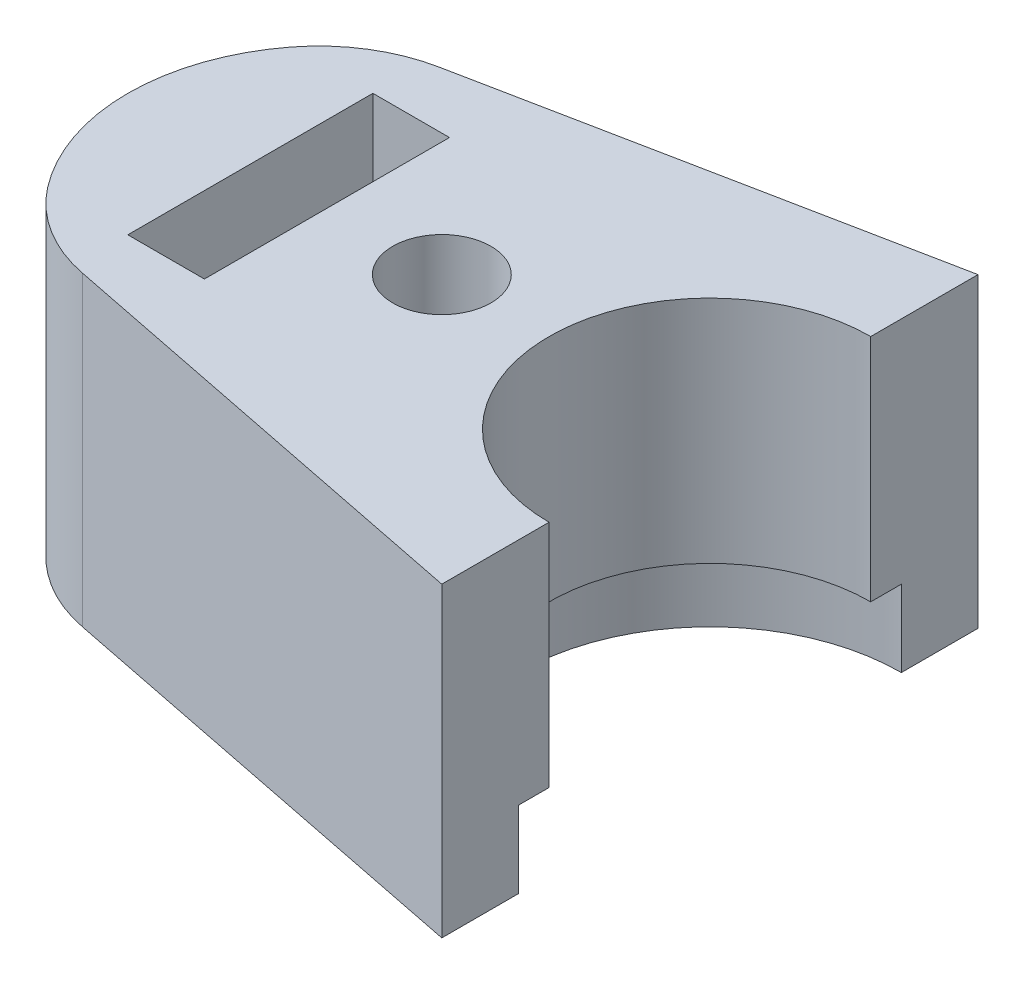
ISO-10303-21;
HEADER;
FILE_DESCRIPTION(('STEP AP214'),'2;1');
FILE_NAME('part.step','',(''),(''),'','','');
FILE_SCHEMA(('AUTOMOTIVE_DESIGN { 1 0 10303 214 1 1 1 1 }'));
ENDSEC;
DATA;
#1=APPLICATION_CONTEXT('core data for automotive mechanical design processes');
#2=APPLICATION_PROTOCOL_DEFINITION('international standard','automotive_design',2000,#1);
#3=PRODUCT_CONTEXT('',#1,'mechanical');
#4=PRODUCT('Part','Part','',(#3));
#5=PRODUCT_RELATED_PRODUCT_CATEGORY('part','',(#4));
#6=PRODUCT_DEFINITION_FORMATION('','',#4);
#7=PRODUCT_DEFINITION_CONTEXT('part definition',#1,'design');
#8=PRODUCT_DEFINITION('design','',#6,#7);
#9=PRODUCT_DEFINITION_SHAPE('','',#8);
#10=(LENGTH_UNIT() NAMED_UNIT(*) SI_UNIT(.MILLI.,.METRE.));
#11=(NAMED_UNIT(*) PLANE_ANGLE_UNIT() SI_UNIT($,.RADIAN.));
#12=(NAMED_UNIT(*) SI_UNIT($,.STERADIAN.) SOLID_ANGLE_UNIT());
#13=UNCERTAINTY_MEASURE_WITH_UNIT(LENGTH_MEASURE(1.E-05),#10,'distance_accuracy_value','');
#14=(GEOMETRIC_REPRESENTATION_CONTEXT(3) GLOBAL_UNCERTAINTY_ASSIGNED_CONTEXT((#13)) GLOBAL_UNIT_ASSIGNED_CONTEXT((#10,
#11,#12)) REPRESENTATION_CONTEXT('',''));
#15=CARTESIAN_POINT('',(0.,0.,0.));
#16=DIRECTION('',(0.,0.,1.));
#17=DIRECTION('',(1.,0.,0.));
#18=AXIS2_PLACEMENT_3D('',#15,#16,#17);
#19=CARTESIAN_POINT('',(0.,0.5,-0.8));
#20=DIRECTION('',(0.,0.,-1.));
#21=DIRECTION('',(-1.,0.,0.));
#22=AXIS2_PLACEMENT_3D('',#19,#20,#21);
#23=PLANE('',#22);
#24=DIRECTION('',(1.,0.,0.));
#25=VECTOR('',#24,1.);
#26=CARTESIAN_POINT('',(0.,0.,-0.8));
#27=LINE('',#26,#25);
#28=CARTESIAN_POINT('',(-4.25,0.,-0.8));
#29=VERTEX_POINT('',#28);
#30=CARTESIAN_POINT('',(-3.75,0.,-0.8));
#31=VERTEX_POINT('',#30);
#32=EDGE_CURVE('E122',#29,#31,#27,.T.);
#33=ORIENTED_EDGE('',*,*,#32,.T.);
#34=DIRECTION('',(0.,-1.,0.));
#35=VECTOR('',#34,1.);
#36=CARTESIAN_POINT('',(-3.75,0.5,-0.8));
#37=LINE('',#36,#35);
#38=CARTESIAN_POINT('',(-3.75,2.,-0.8));
#39=VERTEX_POINT('',#38);
#40=EDGE_CURVE('E11',#39,#31,#37,.T.);
#41=ORIENTED_EDGE('',*,*,#40,.F.);
#42=DIRECTION('',(1.,0.,0.));
#43=VECTOR('',#42,1.);
#44=CARTESIAN_POINT('',(0.,2.,-0.8));
#45=LINE('',#44,#43);
#46=CARTESIAN_POINT('',(-4.25,2.,-0.8));
#47=VERTEX_POINT('',#46);
#48=EDGE_CURVE('E197',#47,#39,#45,.T.);
#49=ORIENTED_EDGE('',*,*,#48,.F.);
#50=DIRECTION('',(0.,-1.,0.));
#51=VECTOR('',#50,1.);
#52=CARTESIAN_POINT('',(-4.25,0.5,-0.8));
#53=LINE('',#52,#51);
#54=EDGE_CURVE('E109',#47,#29,#53,.T.);
#55=ORIENTED_EDGE('',*,*,#54,.T.);
#56=EDGE_LOOP('',(#33,#41,#49,#55));
#57=FACE_BOUND('',#56,.T.);
#58=ADVANCED_FACE('F37',(#57),#23,.F.);
#59=CARTESIAN_POINT('',(-3.75,0.5,0.));
#60=DIRECTION('',(1.,0.,0.));
#61=DIRECTION('',(0.,0.,-1.));
#62=AXIS2_PLACEMENT_3D('',#59,#60,#61);
#63=PLANE('',#62);
#64=DIRECTION('',(0.,0.,1.));
#65=VECTOR('',#64,1.);
#66=CARTESIAN_POINT('',(-3.75,0.,0.));
#67=LINE('',#66,#65);
#68=CARTESIAN_POINT('',(-3.75,0.,0.8));
#69=VERTEX_POINT('',#68);
#70=EDGE_CURVE('E117',#31,#69,#67,.T.);
#71=ORIENTED_EDGE('',*,*,#70,.T.);
#72=DIRECTION('',(0.,-1.,0.));
#73=VECTOR('',#72,1.);
#74=CARTESIAN_POINT('',(-3.75,0.5,0.8));
#75=LINE('',#74,#73);
#76=CARTESIAN_POINT('',(-3.75,2.,0.8));
#77=VERTEX_POINT('',#76);
#78=EDGE_CURVE('E47',#77,#69,#75,.T.);
#79=ORIENTED_EDGE('',*,*,#78,.F.);
#80=DIRECTION('',(0.,0.,1.));
#81=VECTOR('',#80,1.);
#82=CARTESIAN_POINT('',(-3.75,2.,0.));
#83=LINE('',#82,#81);
#84=EDGE_CURVE('E192',#39,#77,#83,.T.);
#85=ORIENTED_EDGE('',*,*,#84,.F.);
#86=ORIENTED_EDGE('',*,*,#40,.T.);
#87=EDGE_LOOP('',(#71,#79,#85,#86));
#88=FACE_BOUND('',#87,.T.);
#89=ADVANCED_FACE('F186',(#88),#63,.F.);
#90=CARTESIAN_POINT('',(0.,0.5,0.8));
#91=DIRECTION('',(0.,0.,-1.));
#92=DIRECTION('',(-1.,0.,0.));
#93=AXIS2_PLACEMENT_3D('',#90,#91,#92);
#94=PLANE('',#93);
#95=DIRECTION('',(1.,0.,0.));
#96=VECTOR('',#95,1.);
#97=CARTESIAN_POINT('',(0.,0.,0.8));
#98=LINE('',#97,#96);
#99=CARTESIAN_POINT('',(-4.25,0.,0.8));
#100=VERTEX_POINT('',#99);
#101=EDGE_CURVE('E112',#100,#69,#98,.T.);
#102=ORIENTED_EDGE('',*,*,#101,.F.);
#103=DIRECTION('',(0.,-1.,0.));
#104=VECTOR('',#103,1.);
#105=CARTESIAN_POINT('',(-4.25,0.5,0.8));
#106=LINE('',#105,#104);
#107=CARTESIAN_POINT('',(-4.25,2.,0.8));
#108=VERTEX_POINT('',#107);
#109=EDGE_CURVE('E97',#108,#100,#106,.T.);
#110=ORIENTED_EDGE('',*,*,#109,.F.);
#111=DIRECTION('',(1.,0.,0.));
#112=VECTOR('',#111,1.);
#113=CARTESIAN_POINT('',(0.,2.,0.8));
#114=LINE('',#113,#112);
#115=EDGE_CURVE('E278',#108,#77,#114,.T.);
#116=ORIENTED_EDGE('',*,*,#115,.T.);
#117=ORIENTED_EDGE('',*,*,#78,.T.);
#118=EDGE_LOOP('',(#102,#110,#116,#117));
#119=FACE_BOUND('',#118,.T.);
#120=ADVANCED_FACE('F113',(#119),#94,.T.);
#121=CARTESIAN_POINT('',(-3.9873014814638,0.5,0.183542929297438));
#122=DIRECTION('',(0.,-1.,0.));
#123=DIRECTION('',(0.,0.,-1.));
#124=AXIS2_PLACEMENT_3D('',#121,#122,#123);
#125=CYLINDRICAL_SURFACE('',#124,1.);
#126=CARTESIAN_POINT('',(-3.9873014814638,0.,0.183542929297438));
#127=DIRECTION('',(0.,1.,0.));
#128=DIRECTION('',(0.,0.,1.));
#129=AXIS2_PLACEMENT_3D('',#126,#127,#128);
#130=CIRCLE('',#129,1.);
#131=CARTESIAN_POINT('',(-4.183235690524,0.,1.16415997265328));
#132=VERTEX_POINT('',#131);
#133=CARTESIAN_POINT('',(-4.77830641967648,0.,0.795352693622231));
#134=VERTEX_POINT('',#133);
#135=EDGE_CURVE('E160',#132,#134,#130,.F.);
#136=ORIENTED_EDGE('',*,*,#135,.F.);
#137=DIRECTION('',(0.,-1.,0.));
#138=VECTOR('',#137,1.);
#139=CARTESIAN_POINT('',(-4.183235690524,0.5,1.16415997265328));
#140=LINE('',#139,#138);
#141=CARTESIAN_POINT('',(-4.183235690524,2.,1.16415997265328));
#142=VERTEX_POINT('',#141);
#143=EDGE_CURVE('E130',#142,#132,#140,.T.);
#144=ORIENTED_EDGE('',*,*,#143,.F.);
#145=CARTESIAN_POINT('',(-3.9873014814638,2.,0.183542929297438));
#146=DIRECTION('',(0.,1.,0.));
#147=DIRECTION('',(0.,0.,1.));
#148=AXIS2_PLACEMENT_3D('',#145,#146,#147);
#149=CIRCLE('',#148,1.);
#150=CARTESIAN_POINT('',(-4.77830641967648,2.,0.795352693622231));
#151=VERTEX_POINT('',#150);
#152=EDGE_CURVE('E270',#142,#151,#149,.F.);
#153=ORIENTED_EDGE('',*,*,#152,.T.);
#154=DIRECTION('',(0.,-1.,0.));
#155=VECTOR('',#154,1.);
#156=CARTESIAN_POINT('',(-4.77830641967648,0.5,0.795352693622231));
#157=LINE('',#156,#155);
#158=EDGE_CURVE('E126',#151,#134,#157,.T.);
#159=ORIENTED_EDGE('',*,*,#158,.T.);
#160=EDGE_LOOP('',(#136,#144,#153,#159));
#161=FACE_BOUND('',#160,.T.);
#162=ADVANCED_FACE('F307',(#161),#125,.T.);
#163=CARTESIAN_POINT('',(-0.384272849561752,0.5,1.92321957143991));
#164=DIRECTION('',(-0.195934209060197,0.,0.980617043355843));
#165=DIRECTION('',(0.980617043355843,0.,0.195934209060197));
#166=AXIS2_PLACEMENT_3D('',#163,#164,#165);
#167=PLANE('',#166);
#168=DIRECTION('',(-0.980617043355843,0.,-0.195934209060197));
#169=VECTOR('',#168,1.);
#170=CARTESIAN_POINT('',(-0.384272849561752,0.,1.92321957143991));
#171=LINE('',#170,#169);
#172=CARTESIAN_POINT('',(-1.24999999999968,0.,1.7502411741825));
#173=VERTEX_POINT('',#172);
#174=EDGE_CURVE('E164',#173,#132,#171,.T.);
#175=ORIENTED_EDGE('',*,*,#174,.F.);
#176=DIRECTION('',(0.,-1.,0.));
#177=VECTOR('',#176,1.);
#178=CARTESIAN_POINT('',(-1.24999999999968,0.5,1.7502411741825));
#179=LINE('',#178,#177);
#180=CARTESIAN_POINT('',(-1.24999999999968,2.,1.7502411741825));
#181=VERTEX_POINT('',#180);
#182=EDGE_CURVE('E144',#181,#173,#179,.T.);
#183=ORIENTED_EDGE('',*,*,#182,.F.);
#184=DIRECTION('',(-0.980617043355843,0.,-0.195934209060197));
#185=VECTOR('',#184,1.);
#186=CARTESIAN_POINT('',(-0.384272849561752,2.,1.92321957143991));
#187=LINE('',#186,#185);
#188=EDGE_CURVE('E249',#181,#142,#187,.T.);
#189=ORIENTED_EDGE('',*,*,#188,.T.);
#190=ORIENTED_EDGE('',*,*,#143,.T.);
#191=EDGE_LOOP('',(#175,#183,#189,#190));
#192=FACE_BOUND('',#191,.T.);
#193=ADVANCED_FACE('F310',(#192),#167,.T.);
#194=CARTESIAN_POINT('',(-1.24999999999968,0.5,0.));
#195=DIRECTION('',(1.,0.,0.));
#196=DIRECTION('',(0.,0.,-1.));
#197=AXIS2_PLACEMENT_3D('',#194,#195,#196);
#198=PLANE('',#197);
#199=DIRECTION('',(0.,0.,1.));
#200=VECTOR('',#199,1.);
#201=CARTESIAN_POINT('',(-1.24999999999968,0.,0.));
#202=LINE('',#201,#200);
#203=CARTESIAN_POINT('',(-1.24999999999968,0.,1.24999999999969));
#204=VERTEX_POINT('',#203);
#205=EDGE_CURVE('E167',#204,#173,#202,.T.);
#206=ORIENTED_EDGE('',*,*,#205,.F.);
#207=DIRECTION('',(0.,-1.,0.));
#208=VECTOR('',#207,1.);
#209=CARTESIAN_POINT('',(-1.24999999999968,0.5,1.24999999999969));
#210=LINE('',#209,#208);
#211=CARTESIAN_POINT('',(-1.24999999999968,0.5,1.24999999999969));
#212=VERTEX_POINT('',#211);
#213=EDGE_CURVE('E146',#212,#204,#210,.T.);
#214=ORIENTED_EDGE('',*,*,#213,.F.);
#215=DIRECTION('',(0.,0.,-1.));
#216=VECTOR('',#215,1.);
#217=CARTESIAN_POINT('',(-1.24999999999968,0.5,0.));
#218=LINE('',#217,#216);
#219=CARTESIAN_POINT('',(-1.24999999999968,0.5,1.04999999999969));
#220=VERTEX_POINT('',#219);
#221=EDGE_CURVE('E55',#212,#220,#218,.T.);
#222=ORIENTED_EDGE('',*,*,#221,.T.);
#223=DIRECTION('',(0.,-1.,0.));
#224=VECTOR('',#223,1.);
#225=CARTESIAN_POINT('',(-1.24999999999968,2.,1.04999999999969));
#226=LINE('',#225,#224);
#227=CARTESIAN_POINT('',(-1.24999999999968,2.,1.04999999999969));
#228=VERTEX_POINT('',#227);
#229=EDGE_CURVE('E252',#228,#220,#226,.T.);
#230=ORIENTED_EDGE('',*,*,#229,.F.);
#231=DIRECTION('',(0.,0.,-1.));
#232=VECTOR('',#231,1.);
#233=CARTESIAN_POINT('',(-1.24999999999968,2.,0.));
#234=LINE('',#233,#232);
#235=EDGE_CURVE('E241',#181,#228,#234,.T.);
#236=ORIENTED_EDGE('',*,*,#235,.F.);
#237=ORIENTED_EDGE('',*,*,#182,.T.);
#238=EDGE_LOOP('',(#206,#214,#222,#230,#236,#237));
#239=FACE_BOUND('',#238,.T.);
#240=ADVANCED_FACE('F254',(#239),#198,.T.);
#241=CARTESIAN_POINT('',(-1.24999999999968,0.5,0.));
#242=DIRECTION('',(0.,-1.,0.));
#243=DIRECTION('',(0.,0.,-1.));
#244=AXIS2_PLACEMENT_3D('',#241,#242,#243);
#245=CYLINDRICAL_SURFACE('',#244,1.24999999999969);
#246=CARTESIAN_POINT('',(-1.24999999999968,0.,0.));
#247=DIRECTION('',(0.,1.,0.));
#248=DIRECTION('',(0.,0.,1.));
#249=AXIS2_PLACEMENT_3D('',#246,#247,#248);
#250=CIRCLE('',#249,1.24999999999969);
#251=CARTESIAN_POINT('',(-1.24999999999968,0.,-1.2499999999997));
#252=VERTEX_POINT('',#251);
#253=EDGE_CURVE('E170',#252,#204,#250,.T.);
#254=ORIENTED_EDGE('',*,*,#253,.F.);
#255=DIRECTION('',(0.,-1.,0.));
#256=VECTOR('',#255,1.);
#257=CARTESIAN_POINT('',(-1.24999999999968,0.5,-1.2499999999997));
#258=LINE('',#257,#256);
#259=CARTESIAN_POINT('',(-1.24999999999968,0.5,-1.2499999999997));
#260=VERTEX_POINT('',#259);
#261=EDGE_CURVE('E143',#260,#252,#258,.T.);
#262=ORIENTED_EDGE('',*,*,#261,.F.);
#263=CARTESIAN_POINT('',(-1.24999999999968,0.5,0.));
#264=DIRECTION('',(0.,1.,0.));
#265=DIRECTION('',(0.,0.,1.));
#266=AXIS2_PLACEMENT_3D('',#263,#264,#265);
#267=CIRCLE('',#266,1.24999999999969);
#268=EDGE_CURVE('E123',#260,#212,#267,.T.);
#269=ORIENTED_EDGE('',*,*,#268,.T.);
#270=ORIENTED_EDGE('',*,*,#213,.T.);
#271=EDGE_LOOP('',(#254,#262,#269,#270));
#272=FACE_BOUND('',#271,.T.);
#273=ADVANCED_FACE('F293',(#272),#245,.F.);
#274=CARTESIAN_POINT('',(-1.24999999999968,0.5,0.));
#275=DIRECTION('',(-1.,0.,0.));
#276=DIRECTION('',(0.,0.,1.));
#277=AXIS2_PLACEMENT_3D('',#274,#275,#276);
#278=PLANE('',#277);
#279=DIRECTION('',(0.,0.,-1.));
#280=VECTOR('',#279,1.);
#281=CARTESIAN_POINT('',(-1.24999999999968,0.,0.));
#282=LINE('',#281,#280);
#283=CARTESIAN_POINT('',(-1.24999999999968,0.,-1.7502411741825));
#284=VERTEX_POINT('',#283);
#285=EDGE_CURVE('E173',#252,#284,#282,.T.);
#286=ORIENTED_EDGE('',*,*,#285,.T.);
#287=DIRECTION('',(0.,-1.,0.));
#288=VECTOR('',#287,1.);
#289=CARTESIAN_POINT('',(-1.24999999999968,0.5,-1.7502411741825));
#290=LINE('',#289,#288);
#291=CARTESIAN_POINT('',(-1.24999999999968,2.,-1.7502411741825));
#292=VERTEX_POINT('',#291);
#293=EDGE_CURVE('E140',#292,#284,#290,.T.);
#294=ORIENTED_EDGE('',*,*,#293,.F.);
#295=DIRECTION('',(0.,0.,1.));
#296=VECTOR('',#295,1.);
#297=CARTESIAN_POINT('',(-1.24999999999968,2.,0.));
#298=LINE('',#297,#296);
#299=CARTESIAN_POINT('',(-1.24999999999968,2.,-1.0499999999997));
#300=VERTEX_POINT('',#299);
#301=EDGE_CURVE('E257',#292,#300,#298,.T.);
#302=ORIENTED_EDGE('',*,*,#301,.T.);
#303=DIRECTION('',(0.,-1.,0.));
#304=VECTOR('',#303,1.);
#305=CARTESIAN_POINT('',(-1.24999999999968,2.,-1.0499999999997));
#306=LINE('',#305,#304);
#307=CARTESIAN_POINT('',(-1.24999999999968,0.5,-1.0499999999997));
#308=VERTEX_POINT('',#307);
#309=EDGE_CURVE('E161',#300,#308,#306,.T.);
#310=ORIENTED_EDGE('',*,*,#309,.T.);
#311=DIRECTION('',(0.,0.,1.));
#312=VECTOR('',#311,1.);
#313=CARTESIAN_POINT('',(-1.24999999999968,0.5,0.));
#314=LINE('',#313,#312);
#315=EDGE_CURVE('E154',#260,#308,#314,.T.);
#316=ORIENTED_EDGE('',*,*,#315,.F.);
#317=ORIENTED_EDGE('',*,*,#261,.T.);
#318=EDGE_LOOP('',(#286,#294,#302,#310,#316,#317));
#319=FACE_BOUND('',#318,.T.);
#320=ADVANCED_FACE('F288',(#319),#278,.F.);
#321=CARTESIAN_POINT('',(-0.384272849561752,0.5,-1.92321957143991));
#322=DIRECTION('',(0.195934209060197,0.,0.980617043355843));
#323=DIRECTION('',(0.980617043355843,0.,-0.195934209060197));
#324=AXIS2_PLACEMENT_3D('',#321,#322,#323);
#325=PLANE('',#324);
#326=DIRECTION('',(-0.980617043355843,0.,0.195934209060197));
#327=VECTOR('',#326,1.);
#328=CARTESIAN_POINT('',(-0.384272849561752,0.,-1.92321957143991));
#329=LINE('',#328,#327);
#330=CARTESIAN_POINT('',(-4.183235690524,0.,-1.16415997265328));
#331=VERTEX_POINT('',#330);
#332=EDGE_CURVE('E176',#284,#331,#329,.T.);
#333=ORIENTED_EDGE('',*,*,#332,.T.);
#334=DIRECTION('',(0.,-1.,0.));
#335=VECTOR('',#334,1.);
#336=CARTESIAN_POINT('',(-4.183235690524,0.5,-1.16415997265328));
#337=LINE('',#336,#335);
#338=CARTESIAN_POINT('',(-4.183235690524,2.,-1.16415997265328));
#339=VERTEX_POINT('',#338);
#340=EDGE_CURVE('E137',#339,#331,#337,.T.);
#341=ORIENTED_EDGE('',*,*,#340,.F.);
#342=DIRECTION('',(-0.980617043355843,0.,0.195934209060197));
#343=VECTOR('',#342,1.);
#344=CARTESIAN_POINT('',(-0.384272849561752,2.,-1.92321957143991));
#345=LINE('',#344,#343);
#346=EDGE_CURVE('E259',#292,#339,#345,.T.);
#347=ORIENTED_EDGE('',*,*,#346,.F.);
#348=ORIENTED_EDGE('',*,*,#293,.T.);
#349=EDGE_LOOP('',(#333,#341,#347,#348));
#350=FACE_BOUND('',#349,.T.);
#351=ADVANCED_FACE('F298',(#350),#325,.F.);
#352=CARTESIAN_POINT('',(-3.9873014814638,0.5,-0.183542929297438));
#353=DIRECTION('',(0.,-1.,0.));
#354=DIRECTION('',(0.,0.,-1.));
#355=AXIS2_PLACEMENT_3D('',#352,#353,#354);
#356=CYLINDRICAL_SURFACE('',#355,1.);
#357=CARTESIAN_POINT('',(-3.9873014814638,0.,-0.183542929297438));
#358=DIRECTION('',(0.,1.,0.));
#359=DIRECTION('',(0.,0.,1.));
#360=AXIS2_PLACEMENT_3D('',#357,#358,#359);
#361=CIRCLE('',#360,1.);
#362=CARTESIAN_POINT('',(-4.77830641967648,0.,-0.795352693622231));
#363=VERTEX_POINT('',#362);
#364=EDGE_CURVE('E179',#331,#363,#361,.T.);
#365=ORIENTED_EDGE('',*,*,#364,.T.);
#366=DIRECTION('',(0.,-1.,0.));
#367=VECTOR('',#366,1.);
#368=CARTESIAN_POINT('',(-4.77830641967648,0.5,-0.795352693622231));
#369=LINE('',#368,#367);
#370=CARTESIAN_POINT('',(-4.77830641967648,2.,-0.795352693622231));
#371=VERTEX_POINT('',#370);
#372=EDGE_CURVE('E134',#371,#363,#369,.T.);
#373=ORIENTED_EDGE('',*,*,#372,.F.);
#374=CARTESIAN_POINT('',(-3.9873014814638,2.,-0.183542929297438));
#375=DIRECTION('',(0.,1.,0.));
#376=DIRECTION('',(0.,0.,1.));
#377=AXIS2_PLACEMENT_3D('',#374,#375,#376);
#378=CIRCLE('',#377,1.);
#379=EDGE_CURVE('E264',#339,#371,#378,.T.);
#380=ORIENTED_EDGE('',*,*,#379,.F.);
#381=ORIENTED_EDGE('',*,*,#340,.T.);
#382=EDGE_LOOP('',(#365,#373,#380,#381));
#383=FACE_BOUND('',#382,.T.);
#384=ADVANCED_FACE('F302',(#383),#356,.T.);
#385=CARTESIAN_POINT('',(-3.75,0.5,0.));
#386=DIRECTION('',(0.,-1.,0.));
#387=DIRECTION('',(0.,0.,-1.));
#388=AXIS2_PLACEMENT_3D('',#385,#386,#387);
#389=CYLINDRICAL_SURFACE('',#388,1.3);
#390=CARTESIAN_POINT('',(-3.75,0.,0.));
#391=DIRECTION('',(0.,1.,0.));
#392=DIRECTION('',(0.,0.,1.));
#393=AXIS2_PLACEMENT_3D('',#390,#391,#392);
#394=CIRCLE('',#393,1.3);
#395=EDGE_CURVE('E182',#363,#134,#394,.T.);
#396=ORIENTED_EDGE('',*,*,#395,.T.);
#397=ORIENTED_EDGE('',*,*,#158,.F.);
#398=CARTESIAN_POINT('',(-3.75,2.,0.));
#399=DIRECTION('',(0.,1.,0.));
#400=DIRECTION('',(0.,0.,1.));
#401=AXIS2_PLACEMENT_3D('',#398,#399,#400);
#402=CIRCLE('',#401,1.3);
#403=EDGE_CURVE('E267',#371,#151,#402,.T.);
#404=ORIENTED_EDGE('',*,*,#403,.F.);
#405=ORIENTED_EDGE('',*,*,#372,.T.);
#406=EDGE_LOOP('',(#396,#397,#404,#405));
#407=FACE_BOUND('',#406,.T.);
#408=ADVANCED_FACE('F304',(#407),#389,.T.);
#409=CARTESIAN_POINT('',(-3.,0.5,0.));
#410=DIRECTION('',(0.,-1.,0.));
#411=DIRECTION('',(0.,0.,-1.));
#412=AXIS2_PLACEMENT_3D('',#409,#410,#411);
#413=CYLINDRICAL_SURFACE('',#412,0.3207);
#414=CARTESIAN_POINT('',(-3.,0.,0.));
#415=DIRECTION('',(0.,1.,0.));
#416=DIRECTION('',(0.,0.,1.));
#417=AXIS2_PLACEMENT_3D('',#414,#415,#416);
#418=CIRCLE('',#417,0.3207);
#419=CARTESIAN_POINT('',(-3.,0.,0.3207));
#420=VERTEX_POINT('',#419);
#421=EDGE_CURVE('E157',#420,#420,#418,.T.);
#422=ORIENTED_EDGE('',*,*,#421,.F.);
#423=EDGE_LOOP('',(#422));
#424=FACE_BOUND('',#423,.T.);
#425=CARTESIAN_POINT('',(-3.,2.,0.));
#426=DIRECTION('',(0.,1.,0.));
#427=DIRECTION('',(0.,0.,1.));
#428=AXIS2_PLACEMENT_3D('',#425,#426,#427);
#429=CIRCLE('',#428,0.3207);
#430=CARTESIAN_POINT('',(-3.,2.,0.3207));
#431=VERTEX_POINT('',#430);
#432=EDGE_CURVE('E250',#431,#431,#429,.T.);
#433=ORIENTED_EDGE('',*,*,#432,.T.);
#434=EDGE_LOOP('',(#433));
#435=FACE_BOUND('',#434,.T.);
#436=ADVANCED_FACE('F39',(#424,#435),#413,.F.);
#437=CARTESIAN_POINT('',(-4.25,0.5,0.));
#438=DIRECTION('',(1.,0.,0.));
#439=DIRECTION('',(0.,0.,-1.));
#440=AXIS2_PLACEMENT_3D('',#437,#438,#439);
#441=PLANE('',#440);
#442=DIRECTION('',(0.,0.,1.));
#443=VECTOR('',#442,1.);
#444=CARTESIAN_POINT('',(-4.25,0.,0.));
#445=LINE('',#444,#443);
#446=EDGE_CURVE('E102',#29,#100,#445,.T.);
#447=ORIENTED_EDGE('',*,*,#446,.F.);
#448=ORIENTED_EDGE('',*,*,#54,.F.);
#449=DIRECTION('',(0.,0.,1.));
#450=VECTOR('',#449,1.);
#451=CARTESIAN_POINT('',(-4.25,2.,0.));
#452=LINE('',#451,#450);
#453=EDGE_CURVE('E105',#47,#108,#452,.T.);
#454=ORIENTED_EDGE('',*,*,#453,.T.);
#455=ORIENTED_EDGE('',*,*,#109,.T.);
#456=EDGE_LOOP('',(#447,#448,#454,#455));
#457=FACE_BOUND('',#456,.T.);
#458=ADVANCED_FACE('F99',(#457),#441,.T.);
#459=CARTESIAN_POINT('',(0.,0.,0.));
#460=DIRECTION('',(0.,1.,0.));
#461=DIRECTION('',(0.,0.,1.));
#462=AXIS2_PLACEMENT_3D('',#459,#460,#461);
#463=PLANE('',#462);
#464=ORIENTED_EDGE('',*,*,#421,.T.);
#465=EDGE_LOOP('',(#464));
#466=FACE_BOUND('',#465,.T.);
#467=ORIENTED_EDGE('',*,*,#135,.T.);
#468=ORIENTED_EDGE('',*,*,#395,.F.);
#469=ORIENTED_EDGE('',*,*,#364,.F.);
#470=ORIENTED_EDGE('',*,*,#332,.F.);
#471=ORIENTED_EDGE('',*,*,#285,.F.);
#472=ORIENTED_EDGE('',*,*,#253,.T.);
#473=ORIENTED_EDGE('',*,*,#205,.T.);
#474=ORIENTED_EDGE('',*,*,#174,.T.);
#475=EDGE_LOOP('',(#467,#468,#469,#470,#471,#472,#473,#474));
#476=FACE_BOUND('',#475,.T.);
#477=ORIENTED_EDGE('',*,*,#32,.F.);
#478=ORIENTED_EDGE('',*,*,#446,.T.);
#479=ORIENTED_EDGE('',*,*,#101,.T.);
#480=ORIENTED_EDGE('',*,*,#70,.F.);
#481=EDGE_LOOP('',(#477,#478,#479,#480));
#482=FACE_BOUND('',#481,.T.);
#483=ADVANCED_FACE('F120',(#466,#476,#482),#463,.F.);
#484=CARTESIAN_POINT('',(-1.24999999999968,2.,0.));
#485=DIRECTION('',(0.,-1.,0.));
#486=DIRECTION('',(0.,0.,-1.));
#487=AXIS2_PLACEMENT_3D('',#484,#485,#486);
#488=CYLINDRICAL_SURFACE('',#487,1.04999999999969);
#489=CARTESIAN_POINT('',(-1.24999999999968,0.5,0.));
#490=DIRECTION('',(0.,1.,0.));
#491=DIRECTION('',(0.,0.,1.));
#492=AXIS2_PLACEMENT_3D('',#489,#490,#491);
#493=CIRCLE('',#492,1.04999999999969);
#494=EDGE_CURVE('E281',#308,#220,#493,.T.);
#495=ORIENTED_EDGE('',*,*,#494,.F.);
#496=ORIENTED_EDGE('',*,*,#309,.F.);
#497=CARTESIAN_POINT('',(-1.24999999999968,2.,0.));
#498=DIRECTION('',(0.,1.,0.));
#499=DIRECTION('',(0.,0.,1.));
#500=AXIS2_PLACEMENT_3D('',#497,#498,#499);
#501=CIRCLE('',#500,1.04999999999969);
#502=EDGE_CURVE('E245',#300,#228,#501,.T.);
#503=ORIENTED_EDGE('',*,*,#502,.T.);
#504=ORIENTED_EDGE('',*,*,#229,.T.);
#505=EDGE_LOOP('',(#495,#496,#503,#504));
#506=FACE_BOUND('',#505,.T.);
#507=ADVANCED_FACE('F256',(#506),#488,.F.);
#508=CARTESIAN_POINT('',(0.,2.,0.));
#509=DIRECTION('',(0.,1.,0.));
#510=DIRECTION('',(0.,0.,1.));
#511=AXIS2_PLACEMENT_3D('',#508,#509,#510);
#512=PLANE('',#511);
#513=ORIENTED_EDGE('',*,*,#502,.F.);
#514=ORIENTED_EDGE('',*,*,#301,.F.);
#515=ORIENTED_EDGE('',*,*,#346,.T.);
#516=ORIENTED_EDGE('',*,*,#379,.T.);
#517=ORIENTED_EDGE('',*,*,#403,.T.);
#518=ORIENTED_EDGE('',*,*,#152,.F.);
#519=ORIENTED_EDGE('',*,*,#188,.F.);
#520=ORIENTED_EDGE('',*,*,#235,.T.);
#521=EDGE_LOOP('',(#513,#514,#515,#516,#517,#518,#519,#520));
#522=FACE_BOUND('',#521,.T.);
#523=ORIENTED_EDGE('',*,*,#432,.F.);
#524=EDGE_LOOP('',(#523));
#525=FACE_BOUND('',#524,.T.);
#526=ORIENTED_EDGE('',*,*,#48,.T.);
#527=ORIENTED_EDGE('',*,*,#84,.T.);
#528=ORIENTED_EDGE('',*,*,#115,.F.);
#529=ORIENTED_EDGE('',*,*,#453,.F.);
#530=EDGE_LOOP('',(#526,#527,#528,#529));
#531=FACE_BOUND('',#530,.T.);
#532=ADVANCED_FACE('F242',(#522,#525,#531),#512,.T.);
#533=CARTESIAN_POINT('',(0.,0.5,0.));
#534=DIRECTION('',(0.,1.,0.));
#535=DIRECTION('',(0.,0.,1.));
#536=AXIS2_PLACEMENT_3D('',#533,#534,#535);
#537=PLANE('',#536);
#538=ORIENTED_EDGE('',*,*,#268,.F.);
#539=ORIENTED_EDGE('',*,*,#315,.T.);
#540=ORIENTED_EDGE('',*,*,#494,.T.);
#541=ORIENTED_EDGE('',*,*,#221,.F.);
#542=EDGE_LOOP('',(#538,#539,#540,#541));
#543=FACE_BOUND('',#542,.T.);
#544=ADVANCED_FACE('F290',(#543),#537,.F.);
#545=CLOSED_SHELL('',(#58,#89,#120,#162,#193,#240,#273,#320,#351,#384,#408,#436,#458,#483,#507,
#532,#544));
#546=MANIFOLD_SOLID_BREP('B2',#545);
#547=ADVANCED_BREP_SHAPE_REPRESENTATION('',(#18,#546),#14);
#548=SHAPE_DEFINITION_REPRESENTATION(#9,#547);
ENDSEC;
END-ISO-10303-21;
